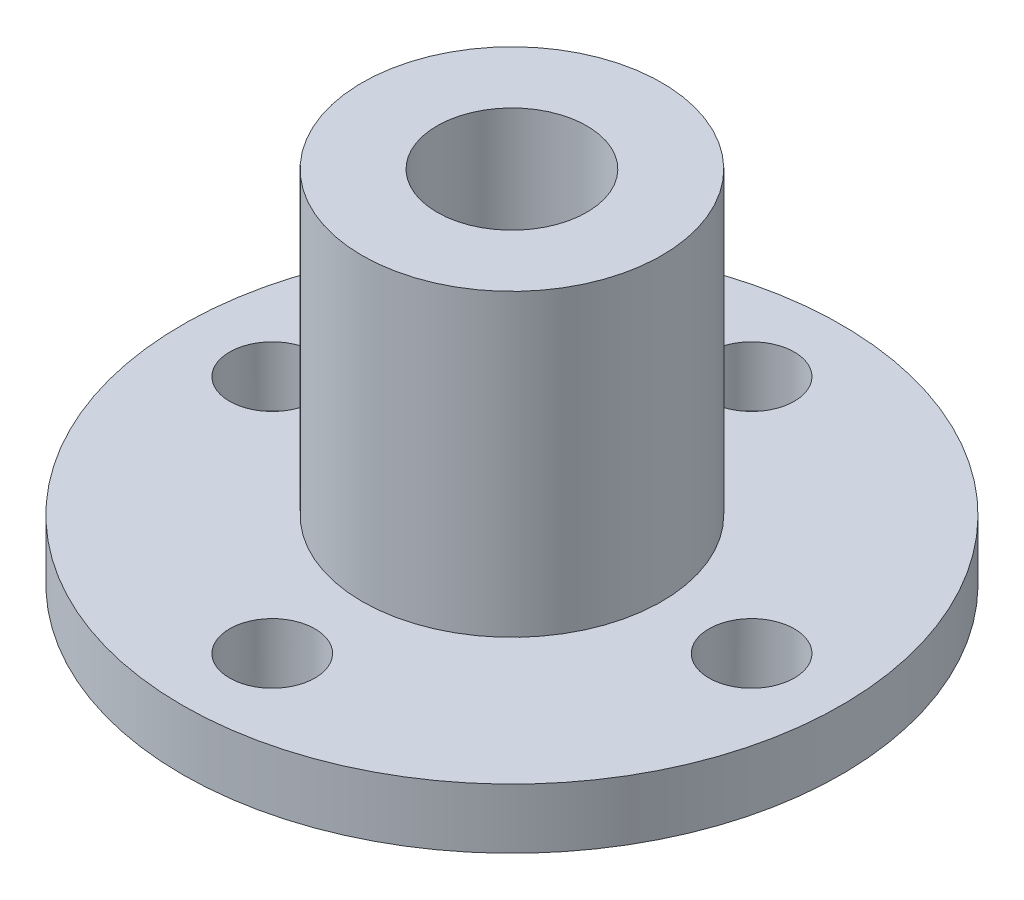
ISO-10303-21;
HEADER;
FILE_DESCRIPTION(('STEP AP214'),'2;1');
FILE_NAME('part.step','',(''),(''),'','','');
FILE_SCHEMA(('AUTOMOTIVE_DESIGN { 1 0 10303 214 1 1 1 1 }'));
ENDSEC;
DATA;
#1=APPLICATION_CONTEXT('core data for automotive mechanical design processes');
#2=APPLICATION_PROTOCOL_DEFINITION('international standard','automotive_design',2000,#1);
#3=PRODUCT_CONTEXT('',#1,'mechanical');
#4=PRODUCT('Part','Part','',(#3));
#5=PRODUCT_RELATED_PRODUCT_CATEGORY('part','',(#4));
#6=PRODUCT_DEFINITION_FORMATION('','',#4);
#7=PRODUCT_DEFINITION_CONTEXT('part definition',#1,'design');
#8=PRODUCT_DEFINITION('design','',#6,#7);
#9=PRODUCT_DEFINITION_SHAPE('','',#8);
#10=(LENGTH_UNIT() NAMED_UNIT(*) SI_UNIT(.MILLI.,.METRE.));
#11=(NAMED_UNIT(*) PLANE_ANGLE_UNIT() SI_UNIT($,.RADIAN.));
#12=(NAMED_UNIT(*) SI_UNIT($,.STERADIAN.) SOLID_ANGLE_UNIT());
#13=UNCERTAINTY_MEASURE_WITH_UNIT(LENGTH_MEASURE(1.E-05),#10,'distance_accuracy_value','');
#14=(GEOMETRIC_REPRESENTATION_CONTEXT(3) GLOBAL_UNCERTAINTY_ASSIGNED_CONTEXT((#13)) GLOBAL_UNIT_ASSIGNED_CONTEXT((#10,
#11,#12)) REPRESENTATION_CONTEXT('',''));
#15=CARTESIAN_POINT('',(0.,0.,0.));
#16=DIRECTION('',(0.,0.,1.));
#17=DIRECTION('',(1.,0.,0.));
#18=AXIS2_PLACEMENT_3D('',#15,#16,#17);
#19=CARTESIAN_POINT('',(0.,2.,0.));
#20=DIRECTION('',(0.,-1.,0.));
#21=DIRECTION('',(0.,0.,-1.));
#22=AXIS2_PLACEMENT_3D('',#19,#20,#21);
#23=CYLINDRICAL_SURFACE('',#22,11.);
#24=CARTESIAN_POINT('',(0.,2.,0.));
#25=DIRECTION('',(0.,1.,0.));
#26=DIRECTION('',(0.,0.,1.));
#27=AXIS2_PLACEMENT_3D('',#24,#25,#26);
#28=CIRCLE('',#27,11.);
#29=CARTESIAN_POINT('',(0.,2.,11.));
#30=VERTEX_POINT('',#29);
#31=EDGE_CURVE('E10',#30,#30,#28,.T.);
#32=ORIENTED_EDGE('',*,*,#31,.F.);
#33=EDGE_LOOP('',(#32));
#34=FACE_BOUND('',#33,.T.);
#35=CARTESIAN_POINT('',(0.,0.,0.));
#36=DIRECTION('',(0.,1.,0.));
#37=DIRECTION('',(0.,0.,1.));
#38=AXIS2_PLACEMENT_3D('',#35,#36,#37);
#39=CIRCLE('',#38,11.);
#40=CARTESIAN_POINT('',(0.,0.,11.));
#41=VERTEX_POINT('',#40);
#42=EDGE_CURVE('E43',#41,#41,#39,.T.);
#43=ORIENTED_EDGE('',*,*,#42,.T.);
#44=EDGE_LOOP('',(#43));
#45=FACE_BOUND('',#44,.T.);
#46=ADVANCED_FACE('F32',(#34,#45),#23,.T.);
#47=CARTESIAN_POINT('',(0.,2.,0.));
#48=DIRECTION('',(0.,-1.,0.));
#49=DIRECTION('',(0.,0.,-1.));
#50=AXIS2_PLACEMENT_3D('',#47,#48,#49);
#51=CYLINDRICAL_SURFACE('',#50,2.5);
#52=CARTESIAN_POINT('',(0.,0.,0.));
#53=DIRECTION('',(0.,1.,0.));
#54=DIRECTION('',(0.,0.,1.));
#55=AXIS2_PLACEMENT_3D('',#52,#53,#54);
#56=CIRCLE('',#55,2.5);
#57=CARTESIAN_POINT('',(0.,0.,2.5));
#58=VERTEX_POINT('',#57);
#59=EDGE_CURVE('E35',#58,#58,#56,.T.);
#60=ORIENTED_EDGE('',*,*,#59,.F.);
#61=EDGE_LOOP('',(#60));
#62=FACE_BOUND('',#61,.T.);
#63=CARTESIAN_POINT('',(0.,12.,0.));
#64=DIRECTION('',(0.,1.,0.));
#65=DIRECTION('',(0.,0.,1.));
#66=AXIS2_PLACEMENT_3D('',#63,#64,#65);
#67=CIRCLE('',#66,2.5);
#68=CARTESIAN_POINT('',(0.,12.,2.5));
#69=VERTEX_POINT('',#68);
#70=EDGE_CURVE('E55',#69,#69,#67,.T.);
#71=ORIENTED_EDGE('',*,*,#70,.T.);
#72=EDGE_LOOP('',(#71));
#73=FACE_BOUND('',#72,.T.);
#74=ADVANCED_FACE('F101',(#62,#73),#51,.F.);
#75=CARTESIAN_POINT('',(0.,2.,0.));
#76=DIRECTION('',(0.,1.,0.));
#77=DIRECTION('',(0.,0.,1.));
#78=AXIS2_PLACEMENT_3D('',#75,#76,#77);
#79=PLANE('',#78);
#80=CARTESIAN_POINT('',(8.,2.,0.));
#81=DIRECTION('',(0.,1.,0.));
#82=DIRECTION('',(0.,0.,1.));
#83=AXIS2_PLACEMENT_3D('',#80,#81,#82);
#84=CIRCLE('',#83,1.425);
#85=CARTESIAN_POINT('',(8.,2.,1.42500000000003));
#86=VERTEX_POINT('',#85);
#87=EDGE_CURVE('E67',#86,#86,#84,.T.);
#88=ORIENTED_EDGE('',*,*,#87,.F.);
#89=EDGE_LOOP('',(#88));
#90=FACE_BOUND('',#89,.T.);
#91=CARTESIAN_POINT('',(0.,2.,8.));
#92=DIRECTION('',(0.,1.,0.));
#93=DIRECTION('',(0.,0.,1.));
#94=AXIS2_PLACEMENT_3D('',#91,#92,#93);
#95=CIRCLE('',#94,1.425);
#96=CARTESIAN_POINT('',(0.,2.,9.425));
#97=VERTEX_POINT('',#96);
#98=EDGE_CURVE('E70',#97,#97,#95,.T.);
#99=ORIENTED_EDGE('',*,*,#98,.F.);
#100=EDGE_LOOP('',(#99));
#101=FACE_BOUND('',#100,.T.);
#102=CARTESIAN_POINT('',(-8.,2.,0.));
#103=DIRECTION('',(0.,1.,0.));
#104=DIRECTION('',(0.,0.,1.));
#105=AXIS2_PLACEMENT_3D('',#102,#103,#104);
#106=CIRCLE('',#105,1.425);
#107=CARTESIAN_POINT('',(-8.,2.,1.42499999999992));
#108=VERTEX_POINT('',#107);
#109=EDGE_CURVE('E73',#108,#108,#106,.T.);
#110=ORIENTED_EDGE('',*,*,#109,.F.);
#111=EDGE_LOOP('',(#110));
#112=FACE_BOUND('',#111,.T.);
#113=CARTESIAN_POINT('',(0.,2.,-8.));
#114=DIRECTION('',(0.,1.,0.));
#115=DIRECTION('',(0.,0.,1.));
#116=AXIS2_PLACEMENT_3D('',#113,#114,#115);
#117=CIRCLE('',#116,1.425);
#118=CARTESIAN_POINT('',(0.,2.,-6.575));
#119=VERTEX_POINT('',#118);
#120=EDGE_CURVE('E59',#119,#119,#117,.T.);
#121=ORIENTED_EDGE('',*,*,#120,.F.);
#122=EDGE_LOOP('',(#121));
#123=FACE_BOUND('',#122,.T.);
#124=CARTESIAN_POINT('',(0.,2.,0.));
#125=DIRECTION('',(0.,1.,0.));
#126=DIRECTION('',(0.,0.,1.));
#127=AXIS2_PLACEMENT_3D('',#124,#125,#126);
#128=CIRCLE('',#127,5.);
#129=CARTESIAN_POINT('',(0.,2.,5.));
#130=VERTEX_POINT('',#129);
#131=EDGE_CURVE('E45',#130,#130,#128,.F.);
#132=ORIENTED_EDGE('',*,*,#131,.T.);
#133=EDGE_LOOP('',(#132));
#134=FACE_BOUND('',#133,.T.);
#135=ORIENTED_EDGE('',*,*,#31,.T.);
#136=EDGE_LOOP('',(#135));
#137=FACE_BOUND('',#136,.T.);
#138=ADVANCED_FACE('F106',(#90,#101,#112,#123,#134,#137),#79,.T.);
#139=CARTESIAN_POINT('',(0.,0.,0.));
#140=DIRECTION('',(0.,1.,0.));
#141=DIRECTION('',(0.,0.,1.));
#142=AXIS2_PLACEMENT_3D('',#139,#140,#141);
#143=PLANE('',#142);
#144=CARTESIAN_POINT('',(8.,0.,0.));
#145=DIRECTION('',(0.,1.,0.));
#146=DIRECTION('',(-1.,0.,0.));
#147=AXIS2_PLACEMENT_3D('',#144,#145,#146);
#148=CIRCLE('',#147,1.425);
#149=CARTESIAN_POINT('',(6.575,0.,0.));
#150=VERTEX_POINT('',#149);
#151=EDGE_CURVE('E76',#150,#150,#148,.T.);
#152=ORIENTED_EDGE('',*,*,#151,.T.);
#153=EDGE_LOOP('',(#152));
#154=FACE_BOUND('',#153,.T.);
#155=CARTESIAN_POINT('',(0.,0.,8.));
#156=DIRECTION('',(0.,1.,0.));
#157=DIRECTION('',(0.,0.,-1.));
#158=AXIS2_PLACEMENT_3D('',#155,#156,#157);
#159=CIRCLE('',#158,1.425);
#160=CARTESIAN_POINT('',(0.,0.,6.575));
#161=VERTEX_POINT('',#160);
#162=EDGE_CURVE('E80',#161,#161,#159,.T.);
#163=ORIENTED_EDGE('',*,*,#162,.T.);
#164=EDGE_LOOP('',(#163));
#165=FACE_BOUND('',#164,.T.);
#166=CARTESIAN_POINT('',(-8.,0.,0.));
#167=DIRECTION('',(0.,1.,0.));
#168=DIRECTION('',(1.,0.,0.));
#169=AXIS2_PLACEMENT_3D('',#166,#167,#168);
#170=CIRCLE('',#169,1.425);
#171=CARTESIAN_POINT('',(-6.575,0.,0.));
#172=VERTEX_POINT('',#171);
#173=EDGE_CURVE('E77',#172,#172,#170,.T.);
#174=ORIENTED_EDGE('',*,*,#173,.T.);
#175=EDGE_LOOP('',(#174));
#176=FACE_BOUND('',#175,.T.);
#177=CARTESIAN_POINT('',(0.,0.,-8.));
#178=DIRECTION('',(0.,1.,0.));
#179=DIRECTION('',(0.,0.,1.));
#180=AXIS2_PLACEMENT_3D('',#177,#178,#179);
#181=CIRCLE('',#180,1.425);
#182=CARTESIAN_POINT('',(0.,0.,-6.575));
#183=VERTEX_POINT('',#182);
#184=EDGE_CURVE('E64',#183,#183,#181,.T.);
#185=ORIENTED_EDGE('',*,*,#184,.T.);
#186=EDGE_LOOP('',(#185));
#187=FACE_BOUND('',#186,.T.);
#188=ORIENTED_EDGE('',*,*,#42,.F.);
#189=EDGE_LOOP('',(#188));
#190=FACE_BOUND('',#189,.T.);
#191=ORIENTED_EDGE('',*,*,#59,.T.);
#192=EDGE_LOOP('',(#191));
#193=FACE_BOUND('',#192,.T.);
#194=ADVANCED_FACE('F86',(#154,#165,#176,#187,#190,#193),#143,.F.);
#195=CARTESIAN_POINT('',(0.,12.,0.));
#196=DIRECTION('',(0.,-1.,0.));
#197=DIRECTION('',(0.,0.,-1.));
#198=AXIS2_PLACEMENT_3D('',#195,#196,#197);
#199=CYLINDRICAL_SURFACE('',#198,5.);
#200=ORIENTED_EDGE('',*,*,#131,.F.);
#201=EDGE_LOOP('',(#200));
#202=FACE_BOUND('',#201,.T.);
#203=CARTESIAN_POINT('',(0.,12.,0.));
#204=DIRECTION('',(0.,1.,0.));
#205=DIRECTION('',(0.,0.,1.));
#206=AXIS2_PLACEMENT_3D('',#203,#204,#205);
#207=CIRCLE('',#206,5.);
#208=CARTESIAN_POINT('',(0.,12.,5.));
#209=VERTEX_POINT('',#208);
#210=EDGE_CURVE('E51',#209,#209,#207,.T.);
#211=ORIENTED_EDGE('',*,*,#210,.F.);
#212=EDGE_LOOP('',(#211));
#213=FACE_BOUND('',#212,.T.);
#214=ADVANCED_FACE('F117',(#202,#213),#199,.T.);
#215=CARTESIAN_POINT('',(0.,12.,0.));
#216=DIRECTION('',(0.,1.,0.));
#217=DIRECTION('',(0.,0.,1.));
#218=AXIS2_PLACEMENT_3D('',#215,#216,#217);
#219=PLANE('',#218);
#220=ORIENTED_EDGE('',*,*,#70,.F.);
#221=EDGE_LOOP('',(#220));
#222=FACE_BOUND('',#221,.T.);
#223=ORIENTED_EDGE('',*,*,#210,.T.);
#224=EDGE_LOOP('',(#223));
#225=FACE_BOUND('',#224,.T.);
#226=ADVANCED_FACE('F121',(#222,#225),#219,.T.);
#227=CARTESIAN_POINT('',(0.,0.,-8.));
#228=DIRECTION('',(0.,1.,0.));
#229=DIRECTION('',(0.,0.,1.));
#230=AXIS2_PLACEMENT_3D('',#227,#228,#229);
#231=CYLINDRICAL_SURFACE('',#230,1.425);
#232=ORIENTED_EDGE('',*,*,#120,.T.);
#233=EDGE_LOOP('',(#232));
#234=FACE_BOUND('',#233,.T.);
#235=ORIENTED_EDGE('',*,*,#184,.F.);
#236=EDGE_LOOP('',(#235));
#237=FACE_BOUND('',#236,.T.);
#238=ADVANCED_FACE('F125',(#234,#237),#231,.F.);
#239=CARTESIAN_POINT('',(-8.,0.,0.));
#240=DIRECTION('',(0.,1.,0.));
#241=DIRECTION('',(0.,0.,1.));
#242=AXIS2_PLACEMENT_3D('',#239,#240,#241);
#243=CYLINDRICAL_SURFACE('',#242,1.425);
#244=ORIENTED_EDGE('',*,*,#109,.T.);
#245=EDGE_LOOP('',(#244));
#246=FACE_BOUND('',#245,.T.);
#247=ORIENTED_EDGE('',*,*,#173,.F.);
#248=EDGE_LOOP('',(#247));
#249=FACE_BOUND('',#248,.T.);
#250=ADVANCED_FACE('F97',(#246,#249),#243,.F.);
#251=CARTESIAN_POINT('',(0.,0.,8.));
#252=DIRECTION('',(0.,1.,0.));
#253=DIRECTION('',(0.,0.,1.));
#254=AXIS2_PLACEMENT_3D('',#251,#252,#253);
#255=CYLINDRICAL_SURFACE('',#254,1.425);
#256=ORIENTED_EDGE('',*,*,#98,.T.);
#257=EDGE_LOOP('',(#256));
#258=FACE_BOUND('',#257,.T.);
#259=ORIENTED_EDGE('',*,*,#162,.F.);
#260=EDGE_LOOP('',(#259));
#261=FACE_BOUND('',#260,.T.);
#262=ADVANCED_FACE('F91',(#258,#261),#255,.F.);
#263=CARTESIAN_POINT('',(8.,0.,0.));
#264=DIRECTION('',(0.,1.,0.));
#265=DIRECTION('',(0.,0.,1.));
#266=AXIS2_PLACEMENT_3D('',#263,#264,#265);
#267=CYLINDRICAL_SURFACE('',#266,1.425);
#268=ORIENTED_EDGE('',*,*,#87,.T.);
#269=EDGE_LOOP('',(#268));
#270=FACE_BOUND('',#269,.T.);
#271=ORIENTED_EDGE('',*,*,#151,.F.);
#272=EDGE_LOOP('',(#271));
#273=FACE_BOUND('',#272,.T.);
#274=ADVANCED_FACE('F89',(#270,#273),#267,.F.);
#275=CLOSED_SHELL('',(#46,#74,#138,#194,#214,#226,#238,#250,#262,#274));
#276=MANIFOLD_SOLID_BREP('B2',#275);
#277=ADVANCED_BREP_SHAPE_REPRESENTATION('',(#18,#276),#14);
#278=SHAPE_DEFINITION_REPRESENTATION(#9,#277);
ENDSEC;
END-ISO-10303-21;
